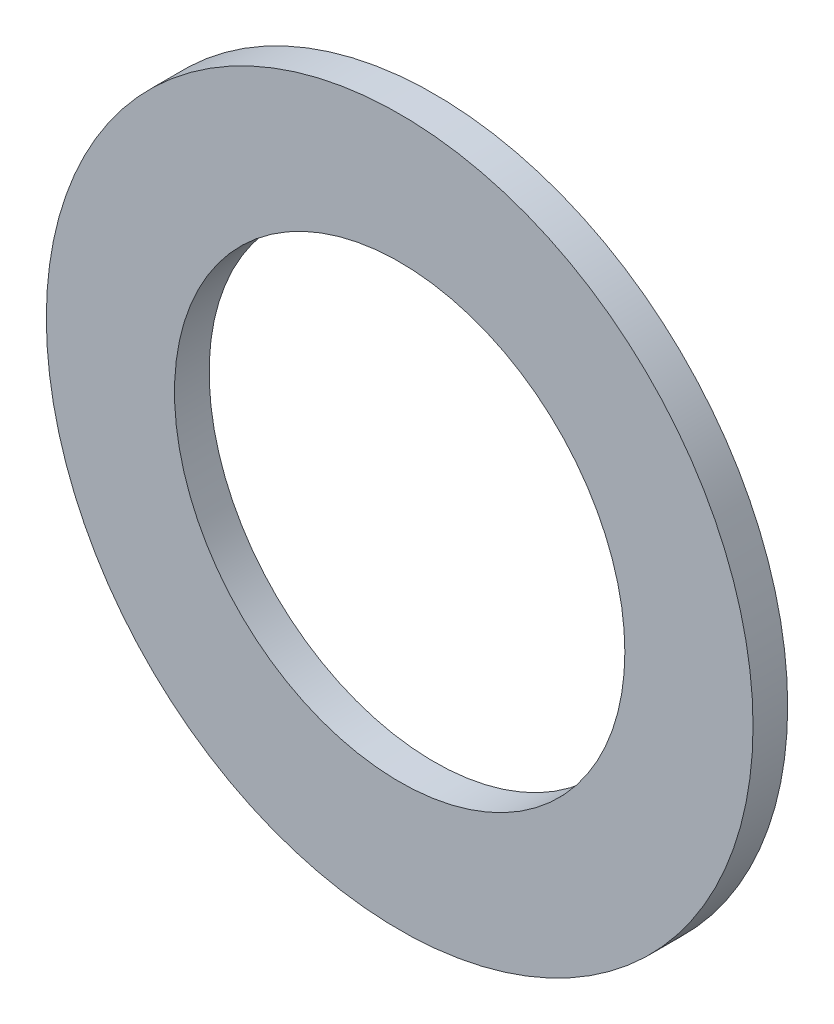
ISO-10303-21;
HEADER;
FILE_DESCRIPTION(('STEP AP214'),'2;1');
FILE_NAME('part.step','',(''),(''),'','','');
FILE_SCHEMA(('AUTOMOTIVE_DESIGN { 1 0 10303 214 1 1 1 1 }'));
ENDSEC;
DATA;
#1=APPLICATION_CONTEXT('core data for automotive mechanical design processes');
#2=APPLICATION_PROTOCOL_DEFINITION('international standard','automotive_design',2000,#1);
#3=PRODUCT_CONTEXT('',#1,'mechanical');
#4=PRODUCT('Part','Part','',(#3));
#5=PRODUCT_RELATED_PRODUCT_CATEGORY('part','',(#4));
#6=PRODUCT_DEFINITION_FORMATION('','',#4);
#7=PRODUCT_DEFINITION_CONTEXT('part definition',#1,'design');
#8=PRODUCT_DEFINITION('design','',#6,#7);
#9=PRODUCT_DEFINITION_SHAPE('','',#8);
#10=(LENGTH_UNIT() NAMED_UNIT(*) SI_UNIT(.MILLI.,.METRE.));
#11=(NAMED_UNIT(*) PLANE_ANGLE_UNIT() SI_UNIT($,.RADIAN.));
#12=(NAMED_UNIT(*) SI_UNIT($,.STERADIAN.) SOLID_ANGLE_UNIT());
#13=UNCERTAINTY_MEASURE_WITH_UNIT(LENGTH_MEASURE(1.E-05),#10,'distance_accuracy_value','');
#14=(GEOMETRIC_REPRESENTATION_CONTEXT(3) GLOBAL_UNCERTAINTY_ASSIGNED_CONTEXT((#13)) GLOBAL_UNIT_ASSIGNED_CONTEXT((#10,
#11,#12)) REPRESENTATION_CONTEXT('',''));
#15=CARTESIAN_POINT('',(0.,0.,0.));
#16=DIRECTION('',(0.,0.,1.));
#17=DIRECTION('',(1.,0.,0.));
#18=AXIS2_PLACEMENT_3D('',#15,#16,#17);
#19=CARTESIAN_POINT('',(0.,0.,0.5));
#20=DIRECTION('',(0.,0.,-1.));
#21=DIRECTION('',(-1.,0.,0.));
#22=AXIS2_PLACEMENT_3D('',#19,#20,#21);
#23=CYLINDRICAL_SURFACE('',#22,3.25);
#24=CARTESIAN_POINT('',(0.,0.,0.5));
#25=DIRECTION('',(0.,0.,1.));
#26=DIRECTION('',(1.,0.,0.));
#27=AXIS2_PLACEMENT_3D('',#24,#25,#26);
#28=CIRCLE('',#27,3.25);
#29=CARTESIAN_POINT('',(3.25,0.,0.5));
#30=VERTEX_POINT('',#29);
#31=EDGE_CURVE('E40',#30,#30,#28,.T.);
#32=ORIENTED_EDGE('',*,*,#31,.T.);
#33=EDGE_LOOP('',(#32));
#34=FACE_BOUND('',#33,.T.);
#35=CARTESIAN_POINT('',(0.,0.,0.));
#36=DIRECTION('',(0.,0.,1.));
#37=DIRECTION('',(1.,0.,0.));
#38=AXIS2_PLACEMENT_3D('',#35,#36,#37);
#39=CIRCLE('',#38,3.25);
#40=CARTESIAN_POINT('',(3.25,0.,0.));
#41=VERTEX_POINT('',#40);
#42=EDGE_CURVE('E46',#41,#41,#39,.T.);
#43=ORIENTED_EDGE('',*,*,#42,.F.);
#44=EDGE_LOOP('',(#43));
#45=FACE_BOUND('',#44,.T.);
#46=ADVANCED_FACE('F33',(#34,#45),#23,.F.);
#47=CARTESIAN_POINT('',(0.,0.,0.5));
#48=DIRECTION('',(0.,0.,-1.));
#49=DIRECTION('',(-1.,0.,0.));
#50=AXIS2_PLACEMENT_3D('',#47,#48,#49);
#51=CYLINDRICAL_SURFACE('',#50,5.1);
#52=CARTESIAN_POINT('',(0.,0.,0.5));
#53=DIRECTION('',(0.,0.,1.));
#54=DIRECTION('',(1.,0.,0.));
#55=AXIS2_PLACEMENT_3D('',#52,#53,#54);
#56=CIRCLE('',#55,5.1);
#57=CARTESIAN_POINT('',(5.1,0.,0.5));
#58=VERTEX_POINT('',#57);
#59=EDGE_CURVE('E10',#58,#58,#56,.T.);
#60=ORIENTED_EDGE('',*,*,#59,.F.);
#61=EDGE_LOOP('',(#60));
#62=FACE_BOUND('',#61,.T.);
#63=CARTESIAN_POINT('',(0.,0.,0.));
#64=DIRECTION('',(0.,0.,1.));
#65=DIRECTION('',(1.,0.,0.));
#66=AXIS2_PLACEMENT_3D('',#63,#64,#65);
#67=CIRCLE('',#66,5.1);
#68=CARTESIAN_POINT('',(5.1,0.,0.));
#69=VERTEX_POINT('',#68);
#70=EDGE_CURVE('E36',#69,#69,#67,.T.);
#71=ORIENTED_EDGE('',*,*,#70,.T.);
#72=EDGE_LOOP('',(#71));
#73=FACE_BOUND('',#72,.T.);
#74=ADVANCED_FACE('F53',(#62,#73),#51,.T.);
#75=CARTESIAN_POINT('',(0.,0.,0.5));
#76=DIRECTION('',(0.,0.,1.));
#77=DIRECTION('',(1.,0.,0.));
#78=AXIS2_PLACEMENT_3D('',#75,#76,#77);
#79=PLANE('',#78);
#80=ORIENTED_EDGE('',*,*,#31,.F.);
#81=EDGE_LOOP('',(#80));
#82=FACE_BOUND('',#81,.T.);
#83=ORIENTED_EDGE('',*,*,#59,.T.);
#84=EDGE_LOOP('',(#83));
#85=FACE_BOUND('',#84,.T.);
#86=ADVANCED_FACE('F57',(#82,#85),#79,.T.);
#87=CARTESIAN_POINT('',(0.,0.,0.));
#88=DIRECTION('',(0.,0.,1.));
#89=DIRECTION('',(1.,0.,0.));
#90=AXIS2_PLACEMENT_3D('',#87,#88,#89);
#91=PLANE('',#90);
#92=ORIENTED_EDGE('',*,*,#42,.T.);
#93=EDGE_LOOP('',(#92));
#94=FACE_BOUND('',#93,.T.);
#95=ORIENTED_EDGE('',*,*,#70,.F.);
#96=EDGE_LOOP('',(#95));
#97=FACE_BOUND('',#96,.T.);
#98=ADVANCED_FACE('F55',(#94,#97),#91,.F.);
#99=CLOSED_SHELL('',(#46,#74,#86,#98));
#100=MANIFOLD_SOLID_BREP('B2',#99);
#101=ADVANCED_BREP_SHAPE_REPRESENTATION('',(#18,#100),#14);
#102=SHAPE_DEFINITION_REPRESENTATION(#9,#101);
ENDSEC;
END-ISO-10303-21;
